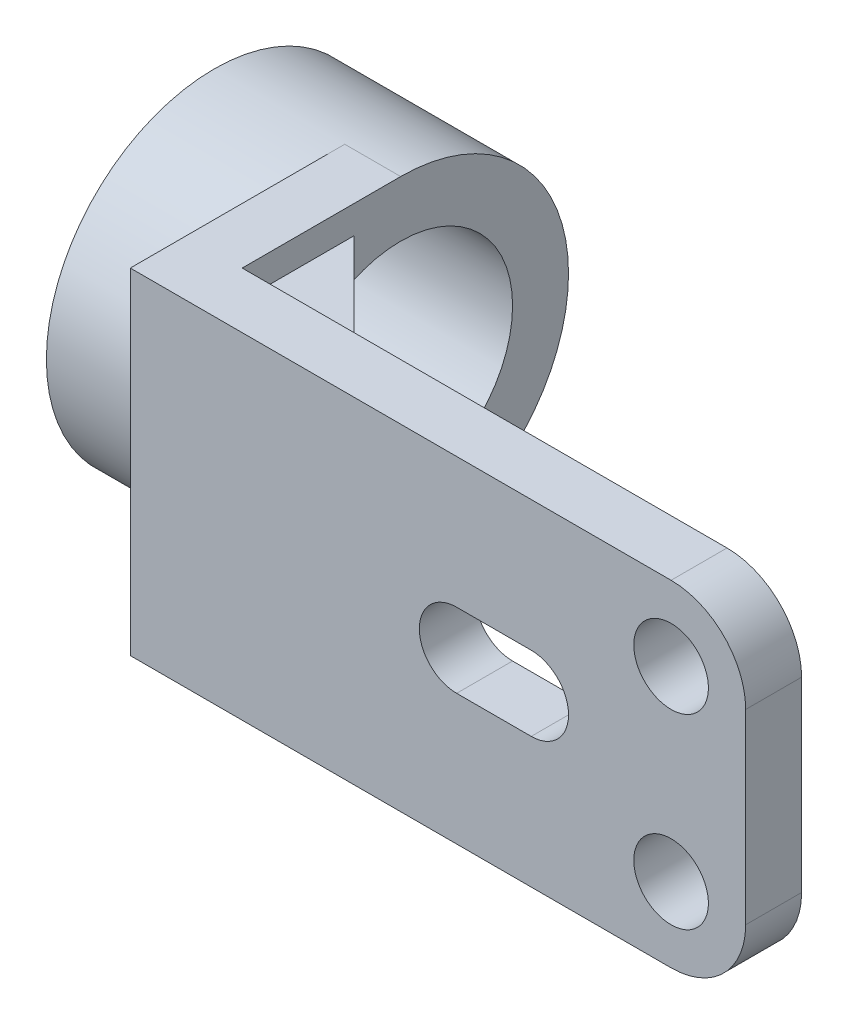
ISO-10303-21;
HEADER;
FILE_DESCRIPTION(('STEP AP214'),'2;1');
FILE_NAME('part.step','',(''),(''),'','','');
FILE_SCHEMA(('AUTOMOTIVE_DESIGN { 1 0 10303 214 1 1 1 1 }'));
ENDSEC;
DATA;
#1=APPLICATION_CONTEXT('core data for automotive mechanical design processes');
#2=APPLICATION_PROTOCOL_DEFINITION('international standard','automotive_design',2000,#1);
#3=PRODUCT_CONTEXT('',#1,'mechanical');
#4=PRODUCT('Part','Part','',(#3));
#5=PRODUCT_RELATED_PRODUCT_CATEGORY('part','',(#4));
#6=PRODUCT_DEFINITION_FORMATION('','',#4);
#7=PRODUCT_DEFINITION_CONTEXT('part definition',#1,'design');
#8=PRODUCT_DEFINITION('design','',#6,#7);
#9=PRODUCT_DEFINITION_SHAPE('','',#8);
#10=(LENGTH_UNIT() NAMED_UNIT(*) SI_UNIT(.MILLI.,.METRE.));
#11=(NAMED_UNIT(*) PLANE_ANGLE_UNIT() SI_UNIT($,.RADIAN.));
#12=(NAMED_UNIT(*) SI_UNIT($,.STERADIAN.) SOLID_ANGLE_UNIT());
#13=UNCERTAINTY_MEASURE_WITH_UNIT(LENGTH_MEASURE(1.E-05),#10,'distance_accuracy_value','');
#14=(GEOMETRIC_REPRESENTATION_CONTEXT(3) GLOBAL_UNCERTAINTY_ASSIGNED_CONTEXT((#13)) GLOBAL_UNIT_ASSIGNED_CONTEXT((#10,
#11,#12)) REPRESENTATION_CONTEXT('',''));
#15=CARTESIAN_POINT('',(0.,0.,0.));
#16=DIRECTION('',(0.,0.,1.));
#17=DIRECTION('',(1.,0.,0.));
#18=AXIS2_PLACEMENT_3D('',#15,#16,#17);
#19=CARTESIAN_POINT('',(6.,36.,-6.00000000000001));
#20=DIRECTION('',(-1.,0.,0.));
#21=DIRECTION('',(0.,0.,1.));
#22=AXIS2_PLACEMENT_3D('',#19,#20,#21);
#23=PLANE('',#22);
#24=CARTESIAN_POINT('',(6.,18.,-23.));
#25=DIRECTION('',(-1.,0.,0.));
#26=DIRECTION('',(0.,0.,1.));
#27=AXIS2_PLACEMENT_3D('',#24,#25,#26);
#28=CIRCLE('',#27,12.);
#29=CARTESIAN_POINT('',(6.,18.,-11.));
#30=VERTEX_POINT('',#29);
#31=EDGE_CURVE('E288',#30,#30,#28,.T.);
#32=ORIENTED_EDGE('',*,*,#31,.T.);
#33=EDGE_LOOP('',(#32));
#34=FACE_BOUND('',#33,.T.);
#35=DIRECTION('',(0.,0.,1.));
#36=VECTOR('',#35,1.);
#37=CARTESIAN_POINT('',(6.,33.,-18.));
#38=LINE('',#37,#36);
#39=CARTESIAN_POINT('',(6.,33.,-18.));
#40=VERTEX_POINT('',#39);
#41=CARTESIAN_POINT('',(6.,33.,-6.00000000000001));
#42=VERTEX_POINT('',#41);
#43=EDGE_CURVE('E216',#40,#42,#38,.T.);
#44=ORIENTED_EDGE('',*,*,#43,.F.);
#45=DIRECTION('',(0.,1.,0.));
#46=VECTOR('',#45,1.);
#47=CARTESIAN_POINT('',(6.,33.,-18.));
#48=LINE('',#47,#46);
#49=CARTESIAN_POINT('',(6.,29.,-18.));
#50=VERTEX_POINT('',#49);
#51=EDGE_CURVE('E199',#50,#40,#48,.T.);
#52=ORIENTED_EDGE('',*,*,#51,.F.);
#53=DIRECTION('',(0.,0.,1.));
#54=VECTOR('',#53,1.);
#55=CARTESIAN_POINT('',(6.,29.,-18.));
#56=LINE('',#55,#54);
#57=CARTESIAN_POINT('',(6.,29.,-6.00000000000001));
#58=VERTEX_POINT('',#57);
#59=EDGE_CURVE('E202',#50,#58,#56,.T.);
#60=ORIENTED_EDGE('',*,*,#59,.T.);
#61=DIRECTION('',(0.,-1.,0.));
#62=VECTOR('',#61,1.);
#63=CARTESIAN_POINT('',(6.,36.,-6.00000000000001));
#64=LINE('',#63,#62);
#65=CARTESIAN_POINT('',(6.,7.,-6.00000000000001));
#66=VERTEX_POINT('',#65);
#67=EDGE_CURVE('E334',#58,#66,#64,.T.);
#68=ORIENTED_EDGE('',*,*,#67,.T.);
#69=DIRECTION('',(0.,0.,1.));
#70=VECTOR('',#69,1.);
#71=CARTESIAN_POINT('',(6.,7.,-18.));
#72=LINE('',#71,#70);
#73=CARTESIAN_POINT('',(6.,7.00000000000001,-18.));
#74=VERTEX_POINT('',#73);
#75=EDGE_CURVE('E194',#74,#66,#72,.T.);
#76=ORIENTED_EDGE('',*,*,#75,.F.);
#77=DIRECTION('',(0.,1.,0.));
#78=VECTOR('',#77,1.);
#79=CARTESIAN_POINT('',(6.,7.,-18.));
#80=LINE('',#79,#78);
#81=CARTESIAN_POINT('',(6.,3.,-18.));
#82=VERTEX_POINT('',#81);
#83=EDGE_CURVE('E186',#82,#74,#80,.T.);
#84=ORIENTED_EDGE('',*,*,#83,.F.);
#85=DIRECTION('',(0.,0.,1.));
#86=VECTOR('',#85,1.);
#87=CARTESIAN_POINT('',(6.,3.,-18.));
#88=LINE('',#87,#86);
#89=CARTESIAN_POINT('',(6.,3.,-6.00000000000001));
#90=VERTEX_POINT('',#89);
#91=EDGE_CURVE('E177',#82,#90,#88,.T.);
#92=ORIENTED_EDGE('',*,*,#91,.T.);
#93=CARTESIAN_POINT('',(6.,0.,-6.00000000000001));
#94=VERTEX_POINT('',#93);
#95=EDGE_CURVE('E184',#90,#94,#64,.T.);
#96=ORIENTED_EDGE('',*,*,#95,.T.);
#97=DIRECTION('',(0.,0.,-1.));
#98=VECTOR('',#97,1.);
#99=CARTESIAN_POINT('',(6.,0.,-6.00000000000001));
#100=LINE('',#99,#98);
#101=CARTESIAN_POINT('',(6.,0.,-23.));
#102=VERTEX_POINT('',#101);
#103=EDGE_CURVE('E307',#94,#102,#100,.T.);
#104=ORIENTED_EDGE('',*,*,#103,.T.);
#105=CARTESIAN_POINT('',(6.,18.,-23.));
#106=DIRECTION('',(-1.,0.,0.));
#107=DIRECTION('',(0.,0.,1.));
#108=AXIS2_PLACEMENT_3D('',#105,#106,#107);
#109=CIRCLE('',#108,18.);
#110=CARTESIAN_POINT('',(6.,36.,-23.));
#111=VERTEX_POINT('',#110);
#112=EDGE_CURVE('E299',#111,#102,#109,.T.);
#113=ORIENTED_EDGE('',*,*,#112,.F.);
#114=DIRECTION('',(0.,0.,-1.));
#115=VECTOR('',#114,1.);
#116=CARTESIAN_POINT('',(6.,36.,-6.00000000000001));
#117=LINE('',#116,#115);
#118=CARTESIAN_POINT('',(6.,36.,-6.00000000000001));
#119=VERTEX_POINT('',#118);
#120=EDGE_CURVE('E314',#119,#111,#117,.T.);
#121=ORIENTED_EDGE('',*,*,#120,.F.);
#122=EDGE_CURVE('E329',#119,#42,#64,.T.);
#123=ORIENTED_EDGE('',*,*,#122,.T.);
#124=EDGE_LOOP('',(#44,#52,#60,#68,#76,#84,#92,#96,#104,#113,#121,#123));
#125=FACE_BOUND('',#124,.T.);
#126=ADVANCED_FACE('F41',(#34,#125),#23,.F.);
#127=CARTESIAN_POINT('',(66.,36.,-6.00000000000002));
#128=DIRECTION('',(0.,0.,1.));
#129=DIRECTION('',(1.,0.,0.));
#130=AXIS2_PLACEMENT_3D('',#127,#128,#129);
#131=PLANE('',#130);
#132=DIRECTION('',(-1.,0.,0.));
#133=VECTOR('',#132,1.);
#134=CARTESIAN_POINT('',(6.,29.,-6.00000000000001));
#135=LINE('',#134,#133);
#136=CARTESIAN_POINT('',(18.,29.,-6.00000000000001));
#137=VERTEX_POINT('',#136);
#138=EDGE_CURVE('E203',#137,#58,#135,.T.);
#139=ORIENTED_EDGE('',*,*,#138,.F.);
#140=DIRECTION('',(0.,-1.,0.));
#141=VECTOR('',#140,1.);
#142=CARTESIAN_POINT('',(18.,33.,-6.00000000000001));
#143=LINE('',#142,#141);
#144=CARTESIAN_POINT('',(18.,33.,-6.00000000000001));
#145=VERTEX_POINT('',#144);
#146=EDGE_CURVE('E207',#145,#137,#143,.T.);
#147=ORIENTED_EDGE('',*,*,#146,.F.);
#148=DIRECTION('',(1.,0.,0.));
#149=VECTOR('',#148,1.);
#150=CARTESIAN_POINT('',(6.,33.,-6.00000000000001));
#151=LINE('',#150,#149);
#152=EDGE_CURVE('E198',#42,#145,#151,.T.);
#153=ORIENTED_EDGE('',*,*,#152,.F.);
#154=ORIENTED_EDGE('',*,*,#122,.F.);
#155=DIRECTION('',(-1.,0.,0.));
#156=VECTOR('',#155,1.);
#157=CARTESIAN_POINT('',(66.,36.,-6.00000000000002));
#158=LINE('',#157,#156);
#159=CARTESIAN_POINT('',(58.,36.,-6.00000000000002));
#160=VERTEX_POINT('',#159);
#161=EDGE_CURVE('E311',#160,#119,#158,.T.);
#162=ORIENTED_EDGE('',*,*,#161,.F.);
#163=CARTESIAN_POINT('',(58.,28.,-6.00000000000002));
#164=DIRECTION('',(0.,0.,1.));
#165=DIRECTION('',(1.,0.,0.));
#166=AXIS2_PLACEMENT_3D('',#163,#164,#165);
#167=CIRCLE('',#166,8.);
#168=CARTESIAN_POINT('',(66.,28.,-6.00000000000002));
#169=VERTEX_POINT('',#168);
#170=EDGE_CURVE('E358',#160,#169,#167,.F.);
#171=ORIENTED_EDGE('',*,*,#170,.T.);
#172=DIRECTION('',(0.,-1.,0.));
#173=VECTOR('',#172,1.);
#174=CARTESIAN_POINT('',(66.,36.,-6.00000000000002));
#175=LINE('',#174,#173);
#176=CARTESIAN_POINT('',(66.,8.,-6.00000000000002));
#177=VERTEX_POINT('',#176);
#178=EDGE_CURVE('E333',#169,#177,#175,.T.);
#179=ORIENTED_EDGE('',*,*,#178,.T.);
#180=CARTESIAN_POINT('',(58.,8.,-6.00000000000002));
#181=DIRECTION('',(0.,0.,1.));
#182=DIRECTION('',(1.,0.,0.));
#183=AXIS2_PLACEMENT_3D('',#180,#181,#182);
#184=CIRCLE('',#183,8.);
#185=CARTESIAN_POINT('',(58.,0.,-6.00000000000002));
#186=VERTEX_POINT('',#185);
#187=EDGE_CURVE('E355',#177,#186,#184,.F.);
#188=ORIENTED_EDGE('',*,*,#187,.T.);
#189=DIRECTION('',(-1.,0.,0.));
#190=VECTOR('',#189,1.);
#191=CARTESIAN_POINT('',(66.,0.,-6.00000000000002));
#192=LINE('',#191,#190);
#193=EDGE_CURVE('E323',#186,#94,#192,.T.);
#194=ORIENTED_EDGE('',*,*,#193,.T.);
#195=ORIENTED_EDGE('',*,*,#95,.F.);
#196=DIRECTION('',(-1.,0.,0.));
#197=VECTOR('',#196,1.);
#198=CARTESIAN_POINT('',(6.,3.,-6.00000000000001));
#199=LINE('',#198,#197);
#200=CARTESIAN_POINT('',(18.,3.,-6.00000000000001));
#201=VERTEX_POINT('',#200);
#202=EDGE_CURVE('E170',#201,#90,#199,.T.);
#203=ORIENTED_EDGE('',*,*,#202,.F.);
#204=DIRECTION('',(0.,-1.,0.));
#205=VECTOR('',#204,1.);
#206=CARTESIAN_POINT('',(18.,7.,-6.00000000000001));
#207=LINE('',#206,#205);
#208=CARTESIAN_POINT('',(18.,7.,-6.00000000000001));
#209=VERTEX_POINT('',#208);
#210=EDGE_CURVE('E164',#209,#201,#207,.T.);
#211=ORIENTED_EDGE('',*,*,#210,.F.);
#212=DIRECTION('',(1.,0.,0.));
#213=VECTOR('',#212,1.);
#214=CARTESIAN_POINT('',(6.,7.,-6.00000000000001));
#215=LINE('',#214,#213);
#216=EDGE_CURVE('E65',#66,#209,#215,.T.);
#217=ORIENTED_EDGE('',*,*,#216,.F.);
#218=ORIENTED_EDGE('',*,*,#67,.F.);
#219=EDGE_LOOP('',(#139,#147,#153,#154,#162,#171,#179,#188,#194,#195,#203,#211,#217,#218));
#220=FACE_BOUND('',#219,.T.);
#221=DIRECTION('',(-1.,0.,0.));
#222=VECTOR('',#221,1.);
#223=CARTESIAN_POINT('',(43.,14.,-6.00000000000001));
#224=LINE('',#223,#222);
#225=CARTESIAN_POINT('',(43.,14.,-6.00000000000001));
#226=VERTEX_POINT('',#225);
#227=CARTESIAN_POINT('',(35.,14.,-6.00000000000001));
#228=VERTEX_POINT('',#227);
#229=EDGE_CURVE('E224',#226,#228,#224,.T.);
#230=ORIENTED_EDGE('',*,*,#229,.F.);
#231=CARTESIAN_POINT('',(43.,18.,-6.00000000000001));
#232=DIRECTION('',(0.,0.,-1.));
#233=DIRECTION('',(-1.,0.,0.));
#234=AXIS2_PLACEMENT_3D('',#231,#232,#233);
#235=CIRCLE('',#234,4.);
#236=CARTESIAN_POINT('',(43.,22.,-6.00000000000001));
#237=VERTEX_POINT('',#236);
#238=EDGE_CURVE('E221',#237,#226,#235,.T.);
#239=ORIENTED_EDGE('',*,*,#238,.F.);
#240=DIRECTION('',(1.,0.,0.));
#241=VECTOR('',#240,1.);
#242=CARTESIAN_POINT('',(43.,22.,-6.00000000000001));
#243=LINE('',#242,#241);
#244=CARTESIAN_POINT('',(35.,22.,-6.00000000000001));
#245=VERTEX_POINT('',#244);
#246=EDGE_CURVE('E233',#245,#237,#243,.T.);
#247=ORIENTED_EDGE('',*,*,#246,.F.);
#248=CARTESIAN_POINT('',(35.,18.,-6.00000000000001));
#249=DIRECTION('',(0.,0.,-1.));
#250=DIRECTION('',(-1.,0.,0.));
#251=AXIS2_PLACEMENT_3D('',#248,#249,#250);
#252=CIRCLE('',#251,4.);
#253=EDGE_CURVE('E229',#228,#245,#252,.T.);
#254=ORIENTED_EDGE('',*,*,#253,.F.);
#255=EDGE_LOOP('',(#230,#239,#247,#254));
#256=FACE_BOUND('',#255,.T.);
#257=CARTESIAN_POINT('',(58.,28.,-6.00000000000002));
#258=DIRECTION('',(0.,0.,-1.));
#259=DIRECTION('',(-1.,0.,0.));
#260=AXIS2_PLACEMENT_3D('',#257,#258,#259);
#261=CIRCLE('',#260,4.);
#262=CARTESIAN_POINT('',(54.,28.,-6.00000000000002));
#263=VERTEX_POINT('',#262);
#264=EDGE_CURVE('E225',#263,#263,#261,.T.);
#265=ORIENTED_EDGE('',*,*,#264,.F.);
#266=EDGE_LOOP('',(#265));
#267=FACE_BOUND('',#266,.T.);
#268=CARTESIAN_POINT('',(58.,8.,-6.00000000000002));
#269=DIRECTION('',(0.,0.,-1.));
#270=DIRECTION('',(-1.,0.,0.));
#271=AXIS2_PLACEMENT_3D('',#268,#269,#270);
#272=CIRCLE('',#271,4.);
#273=CARTESIAN_POINT('',(54.,8.,-6.00000000000002));
#274=VERTEX_POINT('',#273);
#275=EDGE_CURVE('E220',#274,#274,#272,.T.);
#276=ORIENTED_EDGE('',*,*,#275,.F.);
#277=EDGE_LOOP('',(#276));
#278=FACE_BOUND('',#277,.T.);
#279=ADVANCED_FACE('F181',(#220,#256,#267,#278),#131,.F.);
#280=CARTESIAN_POINT('',(0.,36.,-14.));
#281=DIRECTION('',(1.,0.,0.));
#282=DIRECTION('',(0.,0.,-1.));
#283=AXIS2_PLACEMENT_3D('',#280,#281,#282);
#284=PLANE('',#283);
#285=CARTESIAN_POINT('',(0.,18.,-23.));
#286=DIRECTION('',(-1.,0.,0.));
#287=DIRECTION('',(0.,0.,1.));
#288=AXIS2_PLACEMENT_3D('',#285,#286,#287);
#289=CIRCLE('',#288,18.);
#290=CARTESIAN_POINT('',(0.,0.,-23.));
#291=VERTEX_POINT('',#290);
#292=CARTESIAN_POINT('',(0.,36.,-23.));
#293=VERTEX_POINT('',#292);
#294=EDGE_CURVE('E289',#291,#293,#289,.T.);
#295=ORIENTED_EDGE('',*,*,#294,.F.);
#296=DIRECTION('',(0.,0.,1.));
#297=VECTOR('',#296,1.);
#298=CARTESIAN_POINT('',(0.,0.,-14.));
#299=LINE('',#298,#297);
#300=CARTESIAN_POINT('',(0.,0.,0.));
#301=VERTEX_POINT('',#300);
#302=EDGE_CURVE('E302',#291,#301,#299,.T.);
#303=ORIENTED_EDGE('',*,*,#302,.T.);
#304=DIRECTION('',(0.,-1.,0.));
#305=VECTOR('',#304,1.);
#306=CARTESIAN_POINT('',(0.,36.,0.));
#307=LINE('',#306,#305);
#308=CARTESIAN_POINT('',(0.,36.,0.));
#309=VERTEX_POINT('',#308);
#310=EDGE_CURVE('E342',#309,#301,#307,.T.);
#311=ORIENTED_EDGE('',*,*,#310,.F.);
#312=DIRECTION('',(0.,0.,1.));
#313=VECTOR('',#312,1.);
#314=CARTESIAN_POINT('',(0.,36.,-14.));
#315=LINE('',#314,#313);
#316=EDGE_CURVE('E303',#293,#309,#315,.T.);
#317=ORIENTED_EDGE('',*,*,#316,.F.);
#318=EDGE_LOOP('',(#295,#303,#311,#317));
#319=FACE_BOUND('',#318,.T.);
#320=ADVANCED_FACE('F442',(#319),#284,.F.);
#321=CARTESIAN_POINT('',(0.,36.,0.));
#322=DIRECTION('',(0.,1.,0.));
#323=DIRECTION('',(0.,0.,1.));
#324=AXIS2_PLACEMENT_3D('',#321,#322,#323);
#325=PLANE('',#324);
#326=DIRECTION('',(1.,0.,0.));
#327=VECTOR('',#326,1.);
#328=CARTESIAN_POINT('',(0.,36.,0.));
#329=LINE('',#328,#327);
#330=CARTESIAN_POINT('',(58.,36.,0.));
#331=VERTEX_POINT('',#330);
#332=EDGE_CURVE('E306',#309,#331,#329,.T.);
#333=ORIENTED_EDGE('',*,*,#332,.T.);
#334=DIRECTION('',(0.,0.,-1.));
#335=VECTOR('',#334,1.);
#336=CARTESIAN_POINT('',(58.,36.,-6.00000000000002));
#337=LINE('',#336,#335);
#338=EDGE_CURVE('E293',#331,#160,#337,.T.);
#339=ORIENTED_EDGE('',*,*,#338,.T.);
#340=ORIENTED_EDGE('',*,*,#161,.T.);
#341=ORIENTED_EDGE('',*,*,#120,.T.);
#342=DIRECTION('',(-1.,0.,0.));
#343=VECTOR('',#342,1.);
#344=CARTESIAN_POINT('',(36.,36.,-23.));
#345=LINE('',#344,#343);
#346=EDGE_CURVE('E295',#111,#293,#345,.T.);
#347=ORIENTED_EDGE('',*,*,#346,.T.);
#348=ORIENTED_EDGE('',*,*,#316,.T.);
#349=EDGE_LOOP('',(#333,#339,#340,#341,#347,#348));
#350=FACE_BOUND('',#349,.T.);
#351=ADVANCED_FACE('F381',(#350),#325,.T.);
#352=CARTESIAN_POINT('',(0.,0.,0.));
#353=DIRECTION('',(0.,1.,0.));
#354=DIRECTION('',(0.,0.,1.));
#355=AXIS2_PLACEMENT_3D('',#352,#353,#354);
#356=PLANE('',#355);
#357=ORIENTED_EDGE('',*,*,#193,.F.);
#358=DIRECTION('',(0.,0.,-1.));
#359=VECTOR('',#358,1.);
#360=CARTESIAN_POINT('',(58.,0.,0.));
#361=LINE('',#360,#359);
#362=CARTESIAN_POINT('',(58.,0.,0.));
#363=VERTEX_POINT('',#362);
#364=EDGE_CURVE('E11',#186,#363,#361,.F.);
#365=ORIENTED_EDGE('',*,*,#364,.T.);
#366=DIRECTION('',(1.,0.,0.));
#367=VECTOR('',#366,1.);
#368=CARTESIAN_POINT('',(0.,0.,0.));
#369=LINE('',#368,#367);
#370=EDGE_CURVE('E319',#301,#363,#369,.T.);
#371=ORIENTED_EDGE('',*,*,#370,.F.);
#372=ORIENTED_EDGE('',*,*,#302,.F.);
#373=DIRECTION('',(-1.,0.,0.));
#374=VECTOR('',#373,1.);
#375=CARTESIAN_POINT('',(36.,0.,-23.));
#376=LINE('',#375,#374);
#377=EDGE_CURVE('E294',#102,#291,#376,.T.);
#378=ORIENTED_EDGE('',*,*,#377,.F.);
#379=ORIENTED_EDGE('',*,*,#103,.F.);
#380=EDGE_LOOP('',(#357,#365,#371,#372,#378,#379));
#381=FACE_BOUND('',#380,.T.);
#382=ADVANCED_FACE('F395',(#381),#356,.F.);
#383=CARTESIAN_POINT('',(0.,36.,0.));
#384=DIRECTION('',(0.,0.,-1.));
#385=DIRECTION('',(-1.,0.,0.));
#386=AXIS2_PLACEMENT_3D('',#383,#384,#385);
#387=PLANE('',#386);
#388=DIRECTION('',(1.,0.,0.));
#389=VECTOR('',#388,1.);
#390=CARTESIAN_POINT('',(0.,22.,0.));
#391=LINE('',#390,#389);
#392=CARTESIAN_POINT('',(35.,22.,0.));
#393=VERTEX_POINT('',#392);
#394=CARTESIAN_POINT('',(43.,22.,0.));
#395=VERTEX_POINT('',#394);
#396=EDGE_CURVE('E272',#393,#395,#391,.T.);
#397=ORIENTED_EDGE('',*,*,#396,.T.);
#398=CARTESIAN_POINT('',(43.,18.,0.));
#399=DIRECTION('',(0.,0.,-1.));
#400=DIRECTION('',(-1.,0.,0.));
#401=AXIS2_PLACEMENT_3D('',#398,#399,#400);
#402=CIRCLE('',#401,4.);
#403=CARTESIAN_POINT('',(43.,14.,0.));
#404=VERTEX_POINT('',#403);
#405=EDGE_CURVE('E276',#395,#404,#402,.T.);
#406=ORIENTED_EDGE('',*,*,#405,.T.);
#407=DIRECTION('',(-1.,0.,0.));
#408=VECTOR('',#407,1.);
#409=CARTESIAN_POINT('',(0.,14.,0.));
#410=LINE('',#409,#408);
#411=CARTESIAN_POINT('',(35.,14.,0.));
#412=VERTEX_POINT('',#411);
#413=EDGE_CURVE('E264',#404,#412,#410,.T.);
#414=ORIENTED_EDGE('',*,*,#413,.T.);
#415=CARTESIAN_POINT('',(35.,18.,0.));
#416=DIRECTION('',(0.,0.,-1.));
#417=DIRECTION('',(-1.,0.,0.));
#418=AXIS2_PLACEMENT_3D('',#415,#416,#417);
#419=CIRCLE('',#418,4.);
#420=EDGE_CURVE('E268',#412,#393,#419,.T.);
#421=ORIENTED_EDGE('',*,*,#420,.T.);
#422=EDGE_LOOP('',(#397,#406,#414,#421));
#423=FACE_BOUND('',#422,.T.);
#424=CARTESIAN_POINT('',(58.,28.,0.));
#425=DIRECTION('',(0.,0.,-1.));
#426=DIRECTION('',(-1.,0.,0.));
#427=AXIS2_PLACEMENT_3D('',#424,#425,#426);
#428=CIRCLE('',#427,4.);
#429=CARTESIAN_POINT('',(54.,28.,0.));
#430=VERTEX_POINT('',#429);
#431=EDGE_CURVE('E260',#430,#430,#428,.T.);
#432=ORIENTED_EDGE('',*,*,#431,.T.);
#433=EDGE_LOOP('',(#432));
#434=FACE_BOUND('',#433,.T.);
#435=CARTESIAN_POINT('',(58.,8.,0.));
#436=DIRECTION('',(0.,0.,-1.));
#437=DIRECTION('',(-1.,0.,0.));
#438=AXIS2_PLACEMENT_3D('',#435,#436,#437);
#439=CIRCLE('',#438,4.);
#440=CARTESIAN_POINT('',(54.,8.,0.));
#441=VERTEX_POINT('',#440);
#442=EDGE_CURVE('E241',#441,#441,#439,.T.);
#443=ORIENTED_EDGE('',*,*,#442,.T.);
#444=EDGE_LOOP('',(#443));
#445=FACE_BOUND('',#444,.T.);
#446=DIRECTION('',(0.,-1.,0.));
#447=VECTOR('',#446,1.);
#448=CARTESIAN_POINT('',(66.,36.,0.));
#449=LINE('',#448,#447);
#450=CARTESIAN_POINT('',(66.,28.,0.));
#451=VERTEX_POINT('',#450);
#452=CARTESIAN_POINT('',(66.,8.,0.));
#453=VERTEX_POINT('',#452);
#454=EDGE_CURVE('E338',#451,#453,#449,.T.);
#455=ORIENTED_EDGE('',*,*,#454,.F.);
#456=CARTESIAN_POINT('',(58.,28.,0.));
#457=DIRECTION('',(0.,0.,-1.));
#458=DIRECTION('',(-1.,0.,0.));
#459=AXIS2_PLACEMENT_3D('',#456,#457,#458);
#460=CIRCLE('',#459,8.);
#461=EDGE_CURVE('E50',#451,#331,#460,.F.);
#462=ORIENTED_EDGE('',*,*,#461,.T.);
#463=ORIENTED_EDGE('',*,*,#332,.F.);
#464=ORIENTED_EDGE('',*,*,#310,.T.);
#465=ORIENTED_EDGE('',*,*,#370,.T.);
#466=CARTESIAN_POINT('',(58.,8.,0.));
#467=DIRECTION('',(0.,0.,-1.));
#468=DIRECTION('',(-1.,0.,0.));
#469=AXIS2_PLACEMENT_3D('',#466,#467,#468);
#470=CIRCLE('',#469,8.);
#471=EDGE_CURVE('E368',#363,#453,#470,.F.);
#472=ORIENTED_EDGE('',*,*,#471,.T.);
#473=EDGE_LOOP('',(#455,#462,#463,#464,#465,#472));
#474=FACE_BOUND('',#473,.T.);
#475=ADVANCED_FACE('F375',(#423,#434,#445,#474),#387,.F.);
#476=CARTESIAN_POINT('',(66.,36.,0.));
#477=DIRECTION('',(-1.,0.,0.));
#478=DIRECTION('',(0.,0.,1.));
#479=AXIS2_PLACEMENT_3D('',#476,#477,#478);
#480=PLANE('',#479);
#481=ORIENTED_EDGE('',*,*,#178,.F.);
#482=DIRECTION('',(0.,0.,-1.));
#483=VECTOR('',#482,1.);
#484=CARTESIAN_POINT('',(66.,28.,0.));
#485=LINE('',#484,#483);
#486=EDGE_CURVE('E365',#169,#451,#485,.F.);
#487=ORIENTED_EDGE('',*,*,#486,.T.);
#488=ORIENTED_EDGE('',*,*,#454,.T.);
#489=DIRECTION('',(0.,0.,-1.));
#490=VECTOR('',#489,1.);
#491=CARTESIAN_POINT('',(66.,8.,0.));
#492=LINE('',#491,#490);
#493=EDGE_CURVE('E361',#453,#177,#492,.T.);
#494=ORIENTED_EDGE('',*,*,#493,.T.);
#495=EDGE_LOOP('',(#481,#487,#488,#494));
#496=FACE_BOUND('',#495,.T.);
#497=ADVANCED_FACE('F387',(#496),#480,.F.);
#498=CARTESIAN_POINT('',(36.,18.,-23.));
#499=DIRECTION('',(-1.,0.,0.));
#500=DIRECTION('',(0.,0.,1.));
#501=AXIS2_PLACEMENT_3D('',#498,#499,#500);
#502=CYLINDRICAL_SURFACE('',#501,18.);
#503=ORIENTED_EDGE('',*,*,#112,.T.);
#504=ORIENTED_EDGE('',*,*,#377,.T.);
#505=ORIENTED_EDGE('',*,*,#294,.T.);
#506=ORIENTED_EDGE('',*,*,#346,.F.);
#507=EDGE_LOOP('',(#503,#504,#505,#506));
#508=FACE_BOUND('',#507,.T.);
#509=CARTESIAN_POINT('',(-14.,18.,-23.));
#510=DIRECTION('',(-1.,0.,0.));
#511=DIRECTION('',(0.,0.,1.));
#512=AXIS2_PLACEMENT_3D('',#509,#510,#511);
#513=CIRCLE('',#512,18.);
#514=CARTESIAN_POINT('',(-14.,18.,-5.));
#515=VERTEX_POINT('',#514);
#516=EDGE_CURVE('E284',#515,#515,#513,.T.);
#517=ORIENTED_EDGE('',*,*,#516,.F.);
#518=EDGE_LOOP('',(#517));
#519=FACE_BOUND('',#518,.T.);
#520=ADVANCED_FACE('F449',(#508,#519),#502,.T.);
#521=CARTESIAN_POINT('',(36.,18.,-23.));
#522=DIRECTION('',(-1.,0.,0.));
#523=DIRECTION('',(0.,0.,1.));
#524=AXIS2_PLACEMENT_3D('',#521,#522,#523);
#525=CYLINDRICAL_SURFACE('',#524,12.);
#526=ORIENTED_EDGE('',*,*,#31,.F.);
#527=EDGE_LOOP('',(#526));
#528=FACE_BOUND('',#527,.T.);
#529=CARTESIAN_POINT('',(-14.,18.,-23.));
#530=DIRECTION('',(-1.,0.,0.));
#531=DIRECTION('',(0.,0.,1.));
#532=AXIS2_PLACEMENT_3D('',#529,#530,#531);
#533=CIRCLE('',#532,12.);
#534=CARTESIAN_POINT('',(-14.,18.,-11.));
#535=VERTEX_POINT('',#534);
#536=EDGE_CURVE('E280',#535,#535,#533,.T.);
#537=ORIENTED_EDGE('',*,*,#536,.T.);
#538=EDGE_LOOP('',(#537));
#539=FACE_BOUND('',#538,.T.);
#540=ADVANCED_FACE('F487',(#528,#539),#525,.F.);
#541=CARTESIAN_POINT('',(-14.,0.,0.));
#542=DIRECTION('',(-1.,0.,0.));
#543=DIRECTION('',(0.,0.,1.));
#544=AXIS2_PLACEMENT_3D('',#541,#542,#543);
#545=PLANE('',#544);
#546=ORIENTED_EDGE('',*,*,#536,.F.);
#547=EDGE_LOOP('',(#546));
#548=FACE_BOUND('',#547,.T.);
#549=ORIENTED_EDGE('',*,*,#516,.T.);
#550=EDGE_LOOP('',(#549));
#551=FACE_BOUND('',#550,.T.);
#552=ADVANCED_FACE('F483',(#548,#551),#545,.T.);
#553=CARTESIAN_POINT('',(58.,8.,7.99999999999998));
#554=DIRECTION('',(0.,0.,-1.));
#555=DIRECTION('',(-1.,0.,0.));
#556=AXIS2_PLACEMENT_3D('',#553,#554,#555);
#557=CYLINDRICAL_SURFACE('',#556,4.);
#558=ORIENTED_EDGE('',*,*,#275,.T.);
#559=EDGE_LOOP('',(#558));
#560=FACE_BOUND('',#559,.T.);
#561=ORIENTED_EDGE('',*,*,#442,.F.);
#562=EDGE_LOOP('',(#561));
#563=FACE_BOUND('',#562,.T.);
#564=ADVANCED_FACE('F479',(#560,#563),#557,.F.);
#565=CARTESIAN_POINT('',(58.,28.,7.99999999999998));
#566=DIRECTION('',(0.,0.,-1.));
#567=DIRECTION('',(-1.,0.,0.));
#568=AXIS2_PLACEMENT_3D('',#565,#566,#567);
#569=CYLINDRICAL_SURFACE('',#568,4.);
#570=ORIENTED_EDGE('',*,*,#264,.T.);
#571=EDGE_LOOP('',(#570));
#572=FACE_BOUND('',#571,.T.);
#573=ORIENTED_EDGE('',*,*,#431,.F.);
#574=EDGE_LOOP('',(#573));
#575=FACE_BOUND('',#574,.T.);
#576=ADVANCED_FACE('F475',(#572,#575),#569,.F.);
#577=CARTESIAN_POINT('',(43.,18.,7.99999999999999));
#578=DIRECTION('',(0.,0.,-1.));
#579=DIRECTION('',(-1.,0.,0.));
#580=AXIS2_PLACEMENT_3D('',#577,#578,#579);
#581=CYLINDRICAL_SURFACE('',#580,4.);
#582=DIRECTION('',(0.,0.,-1.));
#583=VECTOR('',#582,1.);
#584=CARTESIAN_POINT('',(43.,22.,7.99999999999999));
#585=LINE('',#584,#583);
#586=EDGE_CURVE('E238',#395,#237,#585,.T.);
#587=ORIENTED_EDGE('',*,*,#586,.T.);
#588=ORIENTED_EDGE('',*,*,#238,.T.);
#589=DIRECTION('',(0.,0.,-1.));
#590=VECTOR('',#589,1.);
#591=CARTESIAN_POINT('',(43.,14.,7.99999999999999));
#592=LINE('',#591,#590);
#593=EDGE_CURVE('E237',#404,#226,#592,.T.);
#594=ORIENTED_EDGE('',*,*,#593,.F.);
#595=ORIENTED_EDGE('',*,*,#405,.F.);
#596=EDGE_LOOP('',(#587,#588,#594,#595));
#597=FACE_BOUND('',#596,.T.);
#598=ADVANCED_FACE('F472',(#597),#581,.F.);
#599=CARTESIAN_POINT('',(43.,22.,7.99999999999999));
#600=DIRECTION('',(0.,1.,0.));
#601=DIRECTION('',(0.,0.,1.));
#602=AXIS2_PLACEMENT_3D('',#599,#600,#601);
#603=PLANE('',#602);
#604=DIRECTION('',(0.,0.,-1.));
#605=VECTOR('',#604,1.);
#606=CARTESIAN_POINT('',(35.,22.,7.99999999999999));
#607=LINE('',#606,#605);
#608=EDGE_CURVE('E242',#393,#245,#607,.T.);
#609=ORIENTED_EDGE('',*,*,#608,.T.);
#610=ORIENTED_EDGE('',*,*,#246,.T.);
#611=ORIENTED_EDGE('',*,*,#586,.F.);
#612=ORIENTED_EDGE('',*,*,#396,.F.);
#613=EDGE_LOOP('',(#609,#610,#611,#612));
#614=FACE_BOUND('',#613,.T.);
#615=ADVANCED_FACE('F467',(#614),#603,.F.);
#616=CARTESIAN_POINT('',(35.,18.,7.99999999999999));
#617=DIRECTION('',(0.,0.,-1.));
#618=DIRECTION('',(-1.,0.,0.));
#619=AXIS2_PLACEMENT_3D('',#616,#617,#618);
#620=CYLINDRICAL_SURFACE('',#619,4.);
#621=DIRECTION('',(0.,0.,-1.));
#622=VECTOR('',#621,1.);
#623=CARTESIAN_POINT('',(35.,14.,7.99999999999999));
#624=LINE('',#623,#622);
#625=EDGE_CURVE('E245',#412,#228,#624,.T.);
#626=ORIENTED_EDGE('',*,*,#625,.T.);
#627=ORIENTED_EDGE('',*,*,#253,.T.);
#628=ORIENTED_EDGE('',*,*,#608,.F.);
#629=ORIENTED_EDGE('',*,*,#420,.F.);
#630=EDGE_LOOP('',(#626,#627,#628,#629));
#631=FACE_BOUND('',#630,.T.);
#632=ADVANCED_FACE('F461',(#631),#620,.F.);
#633=CARTESIAN_POINT('',(43.,14.,7.99999999999999));
#634=DIRECTION('',(0.,-1.,0.));
#635=DIRECTION('',(0.,0.,-1.));
#636=AXIS2_PLACEMENT_3D('',#633,#634,#635);
#637=PLANE('',#636);
#638=ORIENTED_EDGE('',*,*,#593,.T.);
#639=ORIENTED_EDGE('',*,*,#229,.T.);
#640=ORIENTED_EDGE('',*,*,#625,.F.);
#641=ORIENTED_EDGE('',*,*,#413,.F.);
#642=EDGE_LOOP('',(#638,#639,#640,#641));
#643=FACE_BOUND('',#642,.T.);
#644=ADVANCED_FACE('F456',(#643),#637,.F.);
#645=CARTESIAN_POINT('',(58.,28.,0.));
#646=DIRECTION('',(0.,0.,1.));
#647=DIRECTION('',(1.,0.,0.));
#648=AXIS2_PLACEMENT_3D('',#645,#646,#647);
#649=CYLINDRICAL_SURFACE('',#648,8.);
#650=ORIENTED_EDGE('',*,*,#461,.F.);
#651=ORIENTED_EDGE('',*,*,#486,.F.);
#652=ORIENTED_EDGE('',*,*,#170,.F.);
#653=ORIENTED_EDGE('',*,*,#338,.F.);
#654=EDGE_LOOP('',(#650,#651,#652,#653));
#655=FACE_BOUND('',#654,.T.);
#656=ADVANCED_FACE('F383',(#655),#649,.T.);
#657=CARTESIAN_POINT('',(58.,8.,0.));
#658=DIRECTION('',(0.,0.,-1.));
#659=DIRECTION('',(-1.,0.,0.));
#660=AXIS2_PLACEMENT_3D('',#657,#658,#659);
#661=CYLINDRICAL_SURFACE('',#660,8.);
#662=ORIENTED_EDGE('',*,*,#471,.F.);
#663=ORIENTED_EDGE('',*,*,#364,.F.);
#664=ORIENTED_EDGE('',*,*,#187,.F.);
#665=ORIENTED_EDGE('',*,*,#493,.F.);
#666=EDGE_LOOP('',(#662,#663,#664,#665));
#667=FACE_BOUND('',#666,.T.);
#668=ADVANCED_FACE('F43',(#667),#661,.T.);
#669=CARTESIAN_POINT('',(6.,33.,-18.));
#670=DIRECTION('',(0.,-1.,0.));
#671=DIRECTION('',(0.,0.,-1.));
#672=AXIS2_PLACEMENT_3D('',#669,#670,#671);
#673=PLANE('',#672);
#674=ORIENTED_EDGE('',*,*,#152,.T.);
#675=DIRECTION('',(-0.707106781186548,0.,-0.707106781186547));
#676=VECTOR('',#675,1.);
#677=CARTESIAN_POINT('',(6.,33.,-18.));
#678=LINE('',#677,#676);
#679=EDGE_CURVE('E415',#145,#40,#678,.T.);
#680=ORIENTED_EDGE('',*,*,#679,.T.);
#681=ORIENTED_EDGE('',*,*,#43,.T.);
#682=EDGE_LOOP('',(#674,#680,#681));
#683=FACE_BOUND('',#682,.T.);
#684=ADVANCED_FACE('F422',(#683),#673,.F.);
#685=CARTESIAN_POINT('',(6.,29.,-18.));
#686=DIRECTION('',(0.,1.,0.));
#687=DIRECTION('',(0.,0.,1.));
#688=AXIS2_PLACEMENT_3D('',#685,#686,#687);
#689=PLANE('',#688);
#690=ORIENTED_EDGE('',*,*,#59,.F.);
#691=DIRECTION('',(0.707106781186548,0.,0.707106781186547));
#692=VECTOR('',#691,1.);
#693=CARTESIAN_POINT('',(6.,29.,-18.));
#694=LINE('',#693,#692);
#695=EDGE_CURVE('E411',#50,#137,#694,.T.);
#696=ORIENTED_EDGE('',*,*,#695,.T.);
#697=ORIENTED_EDGE('',*,*,#138,.T.);
#698=EDGE_LOOP('',(#690,#696,#697));
#699=FACE_BOUND('',#698,.T.);
#700=ADVANCED_FACE('F427',(#699),#689,.F.);
#701=CARTESIAN_POINT('',(6.,7.,-18.));
#702=DIRECTION('',(0.,-1.,0.));
#703=DIRECTION('',(1.,0.,0.));
#704=AXIS2_PLACEMENT_3D('',#701,#702,#703);
#705=PLANE('',#704);
#706=ORIENTED_EDGE('',*,*,#216,.T.);
#707=DIRECTION('',(-0.707106781186548,0.,-0.707106781186547));
#708=VECTOR('',#707,1.);
#709=CARTESIAN_POINT('',(6.,7.,-18.));
#710=LINE('',#709,#708);
#711=EDGE_CURVE('E167',#209,#74,#710,.T.);
#712=ORIENTED_EDGE('',*,*,#711,.T.);
#713=ORIENTED_EDGE('',*,*,#75,.T.);
#714=EDGE_LOOP('',(#706,#712,#713));
#715=FACE_BOUND('',#714,.T.);
#716=ADVANCED_FACE('F409',(#715),#705,.F.);
#717=CARTESIAN_POINT('',(6.,3.,-18.));
#718=DIRECTION('',(0.,1.,0.));
#719=DIRECTION('',(-1.,0.,0.));
#720=AXIS2_PLACEMENT_3D('',#717,#718,#719);
#721=PLANE('',#720);
#722=ORIENTED_EDGE('',*,*,#91,.F.);
#723=DIRECTION('',(-0.707106781186548,0.,-0.707106781186547));
#724=VECTOR('',#723,1.);
#725=CARTESIAN_POINT('',(18.,3.,-6.00000000000001));
#726=LINE('',#725,#724);
#727=EDGE_CURVE('E57',#201,#82,#726,.T.);
#728=ORIENTED_EDGE('',*,*,#727,.F.);
#729=ORIENTED_EDGE('',*,*,#202,.T.);
#730=EDGE_LOOP('',(#722,#728,#729));
#731=FACE_BOUND('',#730,.T.);
#732=ADVANCED_FACE('F175',(#731),#721,.F.);
#733=CARTESIAN_POINT('',(18.,56.,-6.00000000000001));
#734=DIRECTION('',(-0.707106781186547,0.,0.707106781186548));
#735=DIRECTION('',(0.707106781186548,0.,0.707106781186547));
#736=AXIS2_PLACEMENT_3D('',#733,#734,#735);
#737=PLANE('',#736);
#738=ORIENTED_EDGE('',*,*,#210,.T.);
#739=ORIENTED_EDGE('',*,*,#727,.T.);
#740=ORIENTED_EDGE('',*,*,#83,.T.);
#741=ORIENTED_EDGE('',*,*,#711,.F.);
#742=EDGE_LOOP('',(#738,#739,#740,#741));
#743=FACE_BOUND('',#742,.T.);
#744=ADVANCED_FACE('F165',(#743),#737,.F.);
#745=ORIENTED_EDGE('',*,*,#146,.T.);
#746=ORIENTED_EDGE('',*,*,#695,.F.);
#747=ORIENTED_EDGE('',*,*,#51,.T.);
#748=ORIENTED_EDGE('',*,*,#679,.F.);
#749=EDGE_LOOP('',(#745,#746,#747,#748));
#750=FACE_BOUND('',#749,.T.);
#751=ADVANCED_FACE('F425',(#750),#737,.F.);
#752=CLOSED_SHELL('',(#126,#279,#320,#351,#382,#475,#497,#520,#540,#552,#564,#576,#598,#615,
#632,#644,#656,#668,#684,#700,#716,#732,#744,#751));
#753=MANIFOLD_SOLID_BREP('B2',#752);
#754=ADVANCED_BREP_SHAPE_REPRESENTATION('',(#18,#753),#14);
#755=SHAPE_DEFINITION_REPRESENTATION(#9,#754);
ENDSEC;
END-ISO-10303-21;
